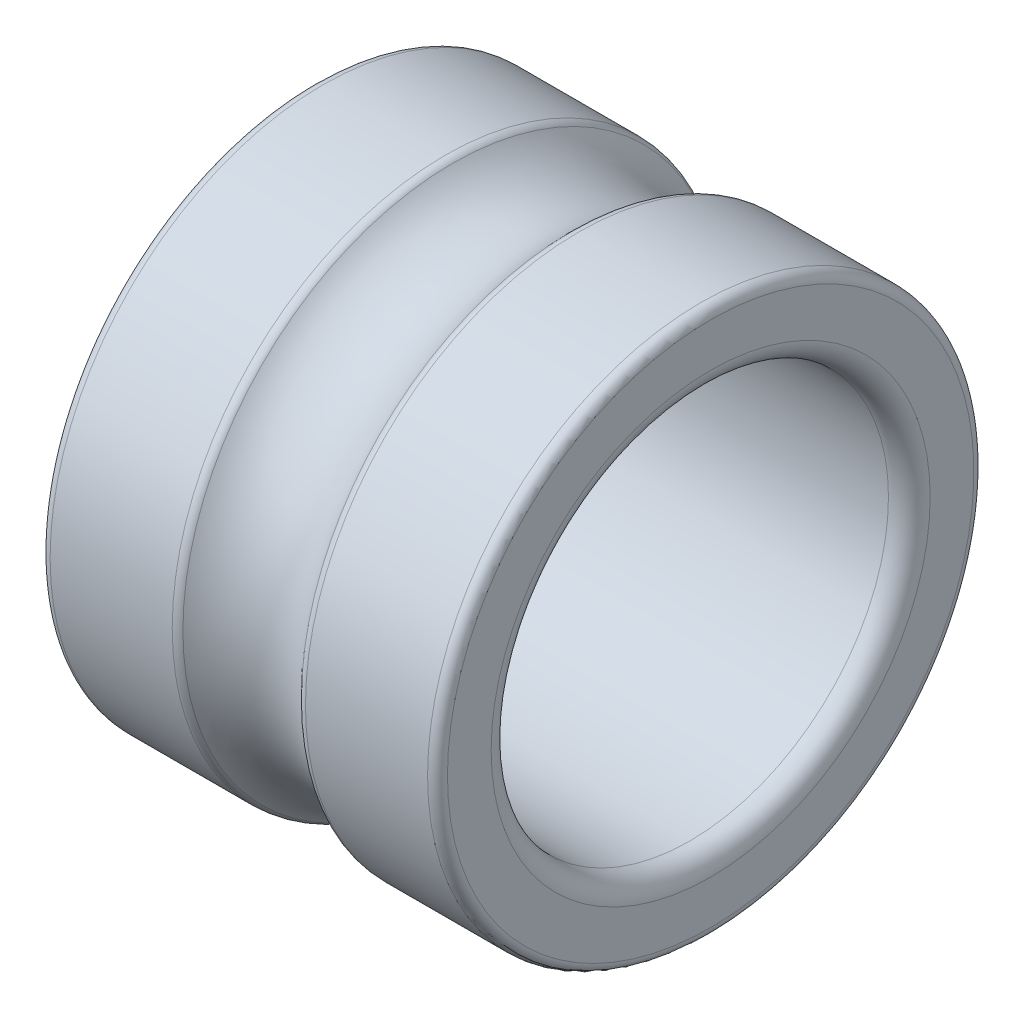
ISO-10303-21;
HEADER;
FILE_DESCRIPTION(('STEP AP214'),'2;1');
FILE_NAME('part.step','',(''),(''),'','','');
FILE_SCHEMA(('AUTOMOTIVE_DESIGN { 1 0 10303 214 1 1 1 1 }'));
ENDSEC;
DATA;
#1=APPLICATION_CONTEXT('core data for automotive mechanical design processes');
#2=APPLICATION_PROTOCOL_DEFINITION('international standard','automotive_design',2000,#1);
#3=PRODUCT_CONTEXT('',#1,'mechanical');
#4=PRODUCT('Part','Part','',(#3));
#5=PRODUCT_RELATED_PRODUCT_CATEGORY('part','',(#4));
#6=PRODUCT_DEFINITION_FORMATION('','',#4);
#7=PRODUCT_DEFINITION_CONTEXT('part definition',#1,'design');
#8=PRODUCT_DEFINITION('design','',#6,#7);
#9=PRODUCT_DEFINITION_SHAPE('','',#8);
#10=(LENGTH_UNIT() NAMED_UNIT(*) SI_UNIT(.MILLI.,.METRE.));
#11=(NAMED_UNIT(*) PLANE_ANGLE_UNIT() SI_UNIT($,.RADIAN.));
#12=(NAMED_UNIT(*) SI_UNIT($,.STERADIAN.) SOLID_ANGLE_UNIT());
#13=UNCERTAINTY_MEASURE_WITH_UNIT(LENGTH_MEASURE(1.E-05),#10,'distance_accuracy_value','');
#14=(GEOMETRIC_REPRESENTATION_CONTEXT(3) GLOBAL_UNCERTAINTY_ASSIGNED_CONTEXT((#13)) GLOBAL_UNIT_ASSIGNED_CONTEXT((#10,
#11,#12)) REPRESENTATION_CONTEXT('',''));
#15=CARTESIAN_POINT('',(0.,0.,0.));
#16=DIRECTION('',(0.,0.,1.));
#17=DIRECTION('',(1.,0.,0.));
#18=AXIS2_PLACEMENT_3D('',#15,#16,#17);
#19=CARTESIAN_POINT('',(-2.,2.75,0.));
#20=DIRECTION('',(1.,0.,0.));
#21=DIRECTION('',(0.,0.,-1.));
#22=AXIS2_PLACEMENT_3D('',#19,#20,#21);
#23=PLANE('',#22);
#24=CARTESIAN_POINT('',(-2.,0.,0.));
#25=DIRECTION('',(1.,0.,0.));
#26=DIRECTION('',(0.,0.,-1.));
#27=AXIS2_PLACEMENT_3D('',#24,#25,#26);
#28=CIRCLE('',#27,2.65);
#29=CARTESIAN_POINT('',(-2.,0.,-2.65));
#30=VERTEX_POINT('',#29);
#31=EDGE_CURVE('E10',#30,#30,#28,.F.);
#32=ORIENTED_EDGE('',*,*,#31,.T.);
#33=EDGE_LOOP('',(#32));
#34=FACE_BOUND('',#33,.T.);
#35=CARTESIAN_POINT('',(-2.,0.,0.));
#36=DIRECTION('',(-1.,0.,0.));
#37=DIRECTION('',(0.,0.,1.));
#38=AXIS2_PLACEMENT_3D('',#35,#36,#37);
#39=CIRCLE('',#38,2.21);
#40=CARTESIAN_POINT('',(-2.,0.,2.21));
#41=VERTEX_POINT('',#40);
#42=EDGE_CURVE('E71',#41,#41,#39,.T.);
#43=ORIENTED_EDGE('',*,*,#42,.F.);
#44=EDGE_LOOP('',(#43));
#45=FACE_BOUND('',#44,.T.);
#46=ADVANCED_FACE('F39',(#34,#45),#23,.F.);
#47=CARTESIAN_POINT('',(-1.79,0.,0.));
#48=DIRECTION('',(-1.,0.,0.));
#49=DIRECTION('',(0.,0.,1.));
#50=AXIS2_PLACEMENT_3D('',#47,#48,#49);
#51=TOROIDAL_SURFACE('',#50,2.21,0.21);
#52=CARTESIAN_POINT('',(-1.79,0.,0.));
#53=DIRECTION('',(-1.,0.,0.));
#54=DIRECTION('',(0.,0.,1.));
#55=AXIS2_PLACEMENT_3D('',#52,#53,#54);
#56=CIRCLE('',#55,2.);
#57=CARTESIAN_POINT('',(-1.79,0.,2.));
#58=VERTEX_POINT('',#57);
#59=EDGE_CURVE('E74',#58,#58,#56,.T.);
#60=ORIENTED_EDGE('',*,*,#59,.F.);
#61=EDGE_LOOP('',(#60));
#62=FACE_BOUND('',#61,.T.);
#63=ORIENTED_EDGE('',*,*,#42,.T.);
#64=EDGE_LOOP('',(#63));
#65=FACE_BOUND('',#64,.T.);
#66=ADVANCED_FACE('F95',(#62,#65),#51,.T.);
#67=CARTESIAN_POINT('',(-6.55526794824098,0.,0.));
#68=DIRECTION('',(-1.,0.,0.));
#69=DIRECTION('',(0.,0.,1.));
#70=AXIS2_PLACEMENT_3D('',#67,#68,#69);
#71=CYLINDRICAL_SURFACE('',#70,2.);
#72=CARTESIAN_POINT('',(1.79,0.,0.));
#73=DIRECTION('',(-1.,0.,0.));
#74=DIRECTION('',(0.,0.,1.));
#75=AXIS2_PLACEMENT_3D('',#72,#73,#74);
#76=CIRCLE('',#75,2.);
#77=CARTESIAN_POINT('',(1.79,0.,2.));
#78=VERTEX_POINT('',#77);
#79=EDGE_CURVE('E77',#78,#78,#76,.T.);
#80=ORIENTED_EDGE('',*,*,#79,.F.);
#81=EDGE_LOOP('',(#80));
#82=FACE_BOUND('',#81,.T.);
#83=ORIENTED_EDGE('',*,*,#59,.T.);
#84=EDGE_LOOP('',(#83));
#85=FACE_BOUND('',#84,.T.);
#86=ADVANCED_FACE('F89',(#82,#85),#71,.F.);
#87=CARTESIAN_POINT('',(1.79,0.,0.));
#88=DIRECTION('',(-1.,0.,0.));
#89=DIRECTION('',(0.,0.,1.));
#90=AXIS2_PLACEMENT_3D('',#87,#88,#89);
#91=TOROIDAL_SURFACE('',#90,2.21,0.21);
#92=CARTESIAN_POINT('',(2.,0.,0.));
#93=DIRECTION('',(-1.,0.,0.));
#94=DIRECTION('',(0.,0.,1.));
#95=AXIS2_PLACEMENT_3D('',#92,#93,#94);
#96=CIRCLE('',#95,2.21);
#97=CARTESIAN_POINT('',(2.,0.,2.21));
#98=VERTEX_POINT('',#97);
#99=EDGE_CURVE('E80',#98,#98,#96,.T.);
#100=ORIENTED_EDGE('',*,*,#99,.F.);
#101=EDGE_LOOP('',(#100));
#102=FACE_BOUND('',#101,.T.);
#103=ORIENTED_EDGE('',*,*,#79,.T.);
#104=EDGE_LOOP('',(#103));
#105=FACE_BOUND('',#104,.T.);
#106=ADVANCED_FACE('F86',(#102,#105),#91,.T.);
#107=CARTESIAN_POINT('',(2.,2.75,0.));
#108=DIRECTION('',(-1.,0.,0.));
#109=DIRECTION('',(0.,0.,1.));
#110=AXIS2_PLACEMENT_3D('',#107,#108,#109);
#111=PLANE('',#110);
#112=CARTESIAN_POINT('',(2.,0.,0.));
#113=DIRECTION('',(-1.,0.,0.));
#114=DIRECTION('',(0.,0.,1.));
#115=AXIS2_PLACEMENT_3D('',#112,#113,#114);
#116=CIRCLE('',#115,2.65);
#117=CARTESIAN_POINT('',(2.,0.,2.65));
#118=VERTEX_POINT('',#117);
#119=EDGE_CURVE('E62',#118,#118,#116,.F.);
#120=ORIENTED_EDGE('',*,*,#119,.T.);
#121=EDGE_LOOP('',(#120));
#122=FACE_BOUND('',#121,.T.);
#123=ORIENTED_EDGE('',*,*,#99,.T.);
#124=EDGE_LOOP('',(#123));
#125=FACE_BOUND('',#124,.T.);
#126=ADVANCED_FACE('F84',(#122,#125),#111,.F.);
#127=CARTESIAN_POINT('',(-6.55526794824098,0.,0.));
#128=DIRECTION('',(-1.,0.,0.));
#129=DIRECTION('',(0.,0.,1.));
#130=AXIS2_PLACEMENT_3D('',#127,#128,#129);
#131=CYLINDRICAL_SURFACE('',#130,2.75);
#132=CARTESIAN_POINT('',(1.9,0.,0.));
#133=DIRECTION('',(-1.,0.,0.));
#134=DIRECTION('',(0.,0.,1.));
#135=AXIS2_PLACEMENT_3D('',#132,#133,#134);
#136=CIRCLE('',#135,2.75);
#137=CARTESIAN_POINT('',(1.9,0.,2.75));
#138=VERTEX_POINT('',#137);
#139=EDGE_CURVE('E65',#138,#138,#136,.T.);
#140=ORIENTED_EDGE('',*,*,#139,.T.);
#141=EDGE_LOOP('',(#140));
#142=FACE_BOUND('',#141,.T.);
#143=CARTESIAN_POINT('',(0.670820393249937,0.,0.));
#144=DIRECTION('',(1.,0.,0.));
#145=DIRECTION('',(0.,0.,-1.));
#146=AXIS2_PLACEMENT_3D('',#143,#144,#145);
#147=CIRCLE('',#146,2.75);
#148=CARTESIAN_POINT('',(0.670820393249937,0.,-2.75));
#149=VERTEX_POINT('',#148);
#150=EDGE_CURVE('E68',#149,#149,#147,.T.);
#151=ORIENTED_EDGE('',*,*,#150,.T.);
#152=EDGE_LOOP('',(#151));
#153=FACE_BOUND('',#152,.T.);
#154=ADVANCED_FACE('F129',(#142,#153),#131,.T.);
#155=CARTESIAN_POINT('',(0.,0.,0.));
#156=DIRECTION('',(-1.,0.,0.));
#157=DIRECTION('',(0.,0.,1.));
#158=AXIS2_PLACEMENT_3D('',#155,#156,#157);
#159=TOROIDAL_SURFACE('',#158,3.25,0.8);
#160=CARTESIAN_POINT('',(0.596284793999945,0.,0.));
#161=DIRECTION('',(-1.,0.,0.));
#162=DIRECTION('',(0.,0.,1.));
#163=AXIS2_PLACEMENT_3D('',#160,#161,#162);
#164=CIRCLE('',#163,2.71666666666667);
#165=CARTESIAN_POINT('',(0.596284793999945,0.,2.71666666666667));
#166=VERTEX_POINT('',#165);
#167=EDGE_CURVE('E54',#166,#166,#164,.T.);
#168=ORIENTED_EDGE('',*,*,#167,.T.);
#169=EDGE_LOOP('',(#168));
#170=FACE_BOUND('',#169,.T.);
#171=CARTESIAN_POINT('',(-0.596284793999944,0.,0.));
#172=DIRECTION('',(1.,0.,0.));
#173=DIRECTION('',(0.,0.,-1.));
#174=AXIS2_PLACEMENT_3D('',#171,#172,#173);
#175=CIRCLE('',#174,2.71666666666667);
#176=CARTESIAN_POINT('',(-0.596284793999944,0.,-2.71666666666667));
#177=VERTEX_POINT('',#176);
#178=EDGE_CURVE('E59',#177,#177,#175,.T.);
#179=ORIENTED_EDGE('',*,*,#178,.T.);
#180=EDGE_LOOP('',(#179));
#181=FACE_BOUND('',#180,.T.);
#182=ADVANCED_FACE('F127',(#170,#181),#159,.F.);
#183=CARTESIAN_POINT('',(-6.55526794824098,0.,0.));
#184=DIRECTION('',(-1.,0.,0.));
#185=DIRECTION('',(0.,0.,1.));
#186=AXIS2_PLACEMENT_3D('',#183,#184,#185);
#187=CYLINDRICAL_SURFACE('',#186,2.75);
#188=CARTESIAN_POINT('',(-0.670820393249937,0.,0.));
#189=DIRECTION('',(1.,0.,0.));
#190=DIRECTION('',(0.,0.,-1.));
#191=AXIS2_PLACEMENT_3D('',#188,#189,#190);
#192=CIRCLE('',#191,2.75);
#193=CARTESIAN_POINT('',(-0.670820393249937,0.,-2.75));
#194=VERTEX_POINT('',#193);
#195=EDGE_CURVE('E46',#194,#194,#192,.F.);
#196=ORIENTED_EDGE('',*,*,#195,.T.);
#197=EDGE_LOOP('',(#196));
#198=FACE_BOUND('',#197,.T.);
#199=CARTESIAN_POINT('',(-1.9,0.,0.));
#200=DIRECTION('',(1.,0.,0.));
#201=DIRECTION('',(0.,0.,-1.));
#202=AXIS2_PLACEMENT_3D('',#199,#200,#201);
#203=CIRCLE('',#202,2.75);
#204=CARTESIAN_POINT('',(-1.9,0.,-2.75));
#205=VERTEX_POINT('',#204);
#206=EDGE_CURVE('E50',#205,#205,#203,.T.);
#207=ORIENTED_EDGE('',*,*,#206,.T.);
#208=EDGE_LOOP('',(#207));
#209=FACE_BOUND('',#208,.T.);
#210=ADVANCED_FACE('F113',(#198,#209),#187,.T.);
#211=CARTESIAN_POINT('',(1.9,0.,0.));
#212=DIRECTION('',(-1.,0.,0.));
#213=DIRECTION('',(0.,0.,1.));
#214=AXIS2_PLACEMENT_3D('',#211,#212,#213);
#215=TOROIDAL_SURFACE('',#214,2.65,0.1);
#216=ORIENTED_EDGE('',*,*,#119,.F.);
#217=EDGE_LOOP('',(#216));
#218=FACE_BOUND('',#217,.T.);
#219=ORIENTED_EDGE('',*,*,#139,.F.);
#220=EDGE_LOOP('',(#219));
#221=FACE_BOUND('',#220,.T.);
#222=ADVANCED_FACE('F109',(#218,#221),#215,.T.);
#223=CARTESIAN_POINT('',(0.670820393249937,0.,0.));
#224=DIRECTION('',(1.,0.,0.));
#225=DIRECTION('',(0.,0.,-1.));
#226=AXIS2_PLACEMENT_3D('',#223,#224,#225);
#227=TOROIDAL_SURFACE('',#226,2.65,0.1);
#228=ORIENTED_EDGE('',*,*,#150,.F.);
#229=EDGE_LOOP('',(#228));
#230=FACE_BOUND('',#229,.T.);
#231=ORIENTED_EDGE('',*,*,#167,.F.);
#232=EDGE_LOOP('',(#231));
#233=FACE_BOUND('',#232,.T.);
#234=ADVANCED_FACE('F112',(#230,#233),#227,.T.);
#235=CARTESIAN_POINT('',(-0.670820393249937,0.,0.));
#236=DIRECTION('',(1.,0.,0.));
#237=DIRECTION('',(0.,0.,-1.));
#238=AXIS2_PLACEMENT_3D('',#235,#236,#237);
#239=TOROIDAL_SURFACE('',#238,2.65,0.1);
#240=ORIENTED_EDGE('',*,*,#178,.F.);
#241=EDGE_LOOP('',(#240));
#242=FACE_BOUND('',#241,.T.);
#243=ORIENTED_EDGE('',*,*,#195,.F.);
#244=EDGE_LOOP('',(#243));
#245=FACE_BOUND('',#244,.T.);
#246=ADVANCED_FACE('F116',(#242,#245),#239,.T.);
#247=CARTESIAN_POINT('',(-1.9,0.,0.));
#248=DIRECTION('',(1.,0.,0.));
#249=DIRECTION('',(0.,0.,-1.));
#250=AXIS2_PLACEMENT_3D('',#247,#248,#249);
#251=TOROIDAL_SURFACE('',#250,2.65,0.1);
#252=ORIENTED_EDGE('',*,*,#206,.F.);
#253=EDGE_LOOP('',(#252));
#254=FACE_BOUND('',#253,.T.);
#255=ORIENTED_EDGE('',*,*,#31,.F.);
#256=EDGE_LOOP('',(#255));
#257=FACE_BOUND('',#256,.T.);
#258=ADVANCED_FACE('F41',(#254,#257),#251,.T.);
#259=CLOSED_SHELL('',(#46,#66,#86,#106,#126,#154,#182,#210,#222,#234,#246,#258));
#260=MANIFOLD_SOLID_BREP('B2',#259);
#261=ADVANCED_BREP_SHAPE_REPRESENTATION('',(#18,#260),#14);
#262=SHAPE_DEFINITION_REPRESENTATION(#9,#261);
ENDSEC;
END-ISO-10303-21;
